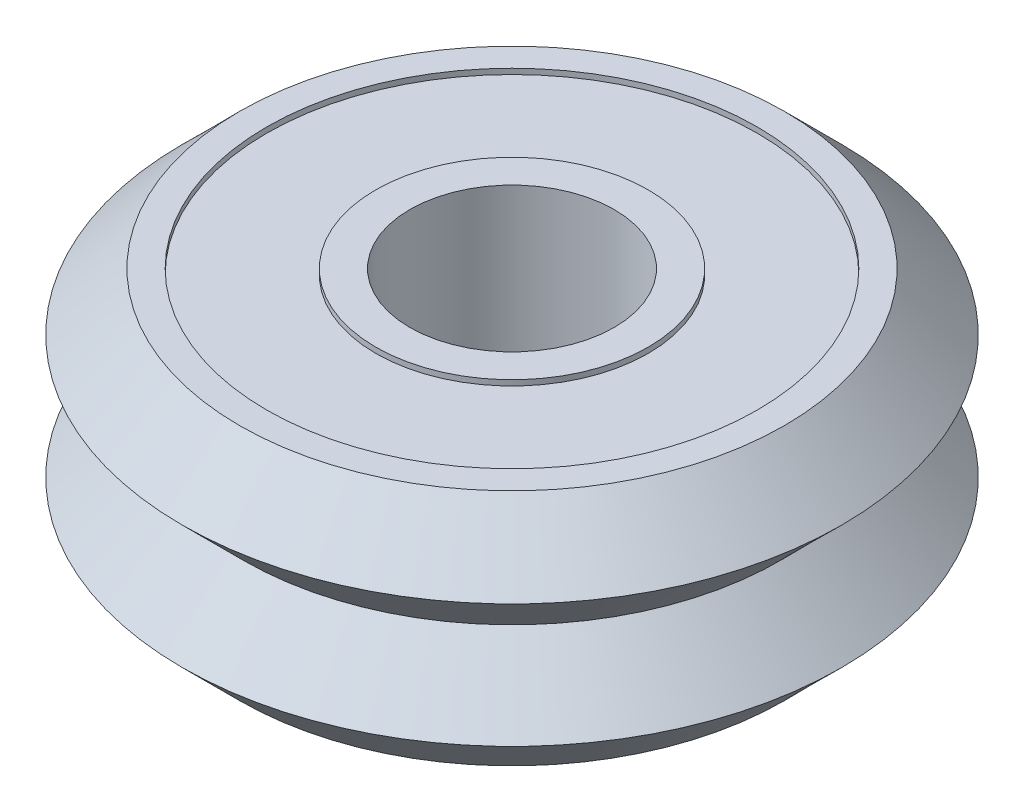
ISO-10303-21;
HEADER;
FILE_DESCRIPTION(('STEP AP214'),'2;1');
FILE_NAME('part.step','',(''),(''),'','','');
FILE_SCHEMA(('AUTOMOTIVE_DESIGN { 1 0 10303 214 1 1 1 1 }'));
ENDSEC;
DATA;
#1=APPLICATION_CONTEXT('core data for automotive mechanical design processes');
#2=APPLICATION_PROTOCOL_DEFINITION('international standard','automotive_design',2000,#1);
#3=PRODUCT_CONTEXT('',#1,'mechanical');
#4=PRODUCT('Part','Part','',(#3));
#5=PRODUCT_RELATED_PRODUCT_CATEGORY('part','',(#4));
#6=PRODUCT_DEFINITION_FORMATION('','',#4);
#7=PRODUCT_DEFINITION_CONTEXT('part definition',#1,'design');
#8=PRODUCT_DEFINITION('design','',#6,#7);
#9=PRODUCT_DEFINITION_SHAPE('','',#8);
#10=(LENGTH_UNIT() NAMED_UNIT(*) SI_UNIT(.MILLI.,.METRE.));
#11=(NAMED_UNIT(*) PLANE_ANGLE_UNIT() SI_UNIT($,.RADIAN.));
#12=(NAMED_UNIT(*) SI_UNIT($,.STERADIAN.) SOLID_ANGLE_UNIT());
#13=UNCERTAINTY_MEASURE_WITH_UNIT(LENGTH_MEASURE(1.E-05),#10,'distance_accuracy_value','');
#14=(GEOMETRIC_REPRESENTATION_CONTEXT(3) GLOBAL_UNCERTAINTY_ASSIGNED_CONTEXT((#13)) GLOBAL_UNIT_ASSIGNED_CONTEXT((#10,
#11,#12)) REPRESENTATION_CONTEXT('',''));
#15=CARTESIAN_POINT('',(0.,0.,0.));
#16=DIRECTION('',(0.,0.,1.));
#17=DIRECTION('',(1.,0.,0.));
#18=AXIS2_PLACEMENT_3D('',#15,#16,#17);
#19=CARTESIAN_POINT('',(6.35,5.296,0.));
#20=DIRECTION('',(0.,1.,0.));
#21=DIRECTION('',(0.,0.,1.));
#22=AXIS2_PLACEMENT_3D('',#19,#20,#21);
#23=PLANE('',#22);
#24=CARTESIAN_POINT('',(0.,5.296,0.));
#25=DIRECTION('',(0.,1.,0.));
#26=DIRECTION('',(0.,0.,1.));
#27=AXIS2_PLACEMENT_3D('',#24,#25,#26);
#28=CIRCLE('',#27,11.43);
#29=CARTESIAN_POINT('',(0.,5.296,11.43));
#30=VERTEX_POINT('',#29);
#31=EDGE_CURVE('E80',#30,#30,#28,.T.);
#32=ORIENTED_EDGE('',*,*,#31,.T.);
#33=EDGE_LOOP('',(#32));
#34=FACE_BOUND('',#33,.T.);
#35=CARTESIAN_POINT('',(0.,5.296,0.));
#36=DIRECTION('',(0.,1.,0.));
#37=DIRECTION('',(0.,0.,1.));
#38=AXIS2_PLACEMENT_3D('',#35,#36,#37);
#39=CIRCLE('',#38,6.35);
#40=CARTESIAN_POINT('',(0.,5.296,6.35));
#41=VERTEX_POINT('',#40);
#42=EDGE_CURVE('E10',#41,#41,#39,.T.);
#43=ORIENTED_EDGE('',*,*,#42,.F.);
#44=EDGE_LOOP('',(#43));
#45=FACE_BOUND('',#44,.T.);
#46=ADVANCED_FACE('F31',(#34,#45),#23,.T.);
#47=CARTESIAN_POINT('',(0.,-5.55,0.));
#48=DIRECTION('',(0.,1.,0.));
#49=DIRECTION('',(0.,0.,1.));
#50=AXIS2_PLACEMENT_3D('',#47,#48,#49);
#51=CYLINDRICAL_SURFACE('',#50,6.35);
#52=ORIENTED_EDGE('',*,*,#42,.T.);
#53=EDGE_LOOP('',(#52));
#54=FACE_BOUND('',#53,.T.);
#55=CARTESIAN_POINT('',(0.,5.55,0.));
#56=DIRECTION('',(0.,1.,0.));
#57=DIRECTION('',(0.,0.,1.));
#58=AXIS2_PLACEMENT_3D('',#55,#56,#57);
#59=CIRCLE('',#58,6.35);
#60=CARTESIAN_POINT('',(0.,5.55,6.35));
#61=VERTEX_POINT('',#60);
#62=EDGE_CURVE('E37',#61,#61,#59,.T.);
#63=ORIENTED_EDGE('',*,*,#62,.F.);
#64=EDGE_LOOP('',(#63));
#65=FACE_BOUND('',#64,.T.);
#66=ADVANCED_FACE('F98',(#54,#65),#51,.T.);
#67=CARTESIAN_POINT('',(4.7625,5.55,0.));
#68=DIRECTION('',(0.,1.,0.));
#69=DIRECTION('',(0.,0.,1.));
#70=AXIS2_PLACEMENT_3D('',#67,#68,#69);
#71=PLANE('',#70);
#72=ORIENTED_EDGE('',*,*,#62,.T.);
#73=EDGE_LOOP('',(#72));
#74=FACE_BOUND('',#73,.T.);
#75=CARTESIAN_POINT('',(0.,5.55,0.));
#76=DIRECTION('',(0.,1.,0.));
#77=DIRECTION('',(0.,0.,1.));
#78=AXIS2_PLACEMENT_3D('',#75,#76,#77);
#79=CIRCLE('',#78,4.7625);
#80=CARTESIAN_POINT('',(0.,5.55,4.7625));
#81=VERTEX_POINT('',#80);
#82=EDGE_CURVE('E41',#81,#81,#79,.T.);
#83=ORIENTED_EDGE('',*,*,#82,.F.);
#84=EDGE_LOOP('',(#83));
#85=FACE_BOUND('',#84,.T.);
#86=ADVANCED_FACE('F102',(#74,#85),#71,.T.);
#87=CARTESIAN_POINT('',(0.,-5.55,0.));
#88=DIRECTION('',(0.,1.,0.));
#89=DIRECTION('',(0.,0.,1.));
#90=AXIS2_PLACEMENT_3D('',#87,#88,#89);
#91=CYLINDRICAL_SURFACE('',#90,4.7625);
#92=ORIENTED_EDGE('',*,*,#82,.T.);
#93=EDGE_LOOP('',(#92));
#94=FACE_BOUND('',#93,.T.);
#95=CARTESIAN_POINT('',(0.,-5.55,0.));
#96=DIRECTION('',(0.,1.,0.));
#97=DIRECTION('',(0.,0.,1.));
#98=AXIS2_PLACEMENT_3D('',#95,#96,#97);
#99=CIRCLE('',#98,4.7625);
#100=CARTESIAN_POINT('',(0.,-5.55,4.7625));
#101=VERTEX_POINT('',#100);
#102=EDGE_CURVE('E45',#101,#101,#99,.T.);
#103=ORIENTED_EDGE('',*,*,#102,.F.);
#104=EDGE_LOOP('',(#103));
#105=FACE_BOUND('',#104,.T.);
#106=ADVANCED_FACE('F106',(#94,#105),#91,.F.);
#107=CARTESIAN_POINT('',(6.35,-5.55,0.));
#108=DIRECTION('',(0.,-1.,0.));
#109=DIRECTION('',(0.,0.,-1.));
#110=AXIS2_PLACEMENT_3D('',#107,#108,#109);
#111=PLANE('',#110);
#112=ORIENTED_EDGE('',*,*,#102,.T.);
#113=EDGE_LOOP('',(#112));
#114=FACE_BOUND('',#113,.T.);
#115=CARTESIAN_POINT('',(0.,-5.55,0.));
#116=DIRECTION('',(0.,1.,0.));
#117=DIRECTION('',(0.,0.,1.));
#118=AXIS2_PLACEMENT_3D('',#115,#116,#117);
#119=CIRCLE('',#118,6.35);
#120=CARTESIAN_POINT('',(0.,-5.55,6.35));
#121=VERTEX_POINT('',#120);
#122=EDGE_CURVE('E50',#121,#121,#119,.T.);
#123=ORIENTED_EDGE('',*,*,#122,.F.);
#124=EDGE_LOOP('',(#123));
#125=FACE_BOUND('',#124,.T.);
#126=ADVANCED_FACE('F112',(#114,#125),#111,.T.);
#127=CARTESIAN_POINT('',(0.,-5.55,0.));
#128=DIRECTION('',(0.,1.,0.));
#129=DIRECTION('',(0.,0.,1.));
#130=AXIS2_PLACEMENT_3D('',#127,#128,#129);
#131=CYLINDRICAL_SURFACE('',#130,6.35);
#132=ORIENTED_EDGE('',*,*,#122,.T.);
#133=EDGE_LOOP('',(#132));
#134=FACE_BOUND('',#133,.T.);
#135=CARTESIAN_POINT('',(0.,-5.296,0.));
#136=DIRECTION('',(0.,1.,0.));
#137=DIRECTION('',(0.,0.,1.));
#138=AXIS2_PLACEMENT_3D('',#135,#136,#137);
#139=CIRCLE('',#138,6.35);
#140=CARTESIAN_POINT('',(0.,-5.296,6.35));
#141=VERTEX_POINT('',#140);
#142=EDGE_CURVE('E53',#141,#141,#139,.T.);
#143=ORIENTED_EDGE('',*,*,#142,.F.);
#144=EDGE_LOOP('',(#143));
#145=FACE_BOUND('',#144,.T.);
#146=ADVANCED_FACE('F116',(#134,#145),#131,.T.);
#147=CARTESIAN_POINT('',(11.43,-5.296,0.));
#148=DIRECTION('',(0.,-1.,0.));
#149=DIRECTION('',(0.,0.,-1.));
#150=AXIS2_PLACEMENT_3D('',#147,#148,#149);
#151=PLANE('',#150);
#152=ORIENTED_EDGE('',*,*,#142,.T.);
#153=EDGE_LOOP('',(#152));
#154=FACE_BOUND('',#153,.T.);
#155=CARTESIAN_POINT('',(0.,-5.296,0.));
#156=DIRECTION('',(0.,1.,0.));
#157=DIRECTION('',(0.,0.,1.));
#158=AXIS2_PLACEMENT_3D('',#155,#156,#157);
#159=CIRCLE('',#158,11.43);
#160=CARTESIAN_POINT('',(0.,-5.296,11.43));
#161=VERTEX_POINT('',#160);
#162=EDGE_CURVE('E56',#161,#161,#159,.T.);
#163=ORIENTED_EDGE('',*,*,#162,.F.);
#164=EDGE_LOOP('',(#163));
#165=FACE_BOUND('',#164,.T.);
#166=ADVANCED_FACE('F120',(#154,#165),#151,.T.);
#167=CARTESIAN_POINT('',(0.,-5.55,0.));
#168=DIRECTION('',(0.,1.,0.));
#169=DIRECTION('',(0.,0.,1.));
#170=AXIS2_PLACEMENT_3D('',#167,#168,#169);
#171=CYLINDRICAL_SURFACE('',#170,11.43);
#172=ORIENTED_EDGE('',*,*,#162,.T.);
#173=EDGE_LOOP('',(#172));
#174=FACE_BOUND('',#173,.T.);
#175=CARTESIAN_POINT('',(0.,-5.55,0.));
#176=DIRECTION('',(0.,1.,0.));
#177=DIRECTION('',(0.,0.,1.));
#178=AXIS2_PLACEMENT_3D('',#175,#176,#177);
#179=CIRCLE('',#178,11.43);
#180=CARTESIAN_POINT('',(0.,-5.55,11.43));
#181=VERTEX_POINT('',#180);
#182=EDGE_CURVE('E59',#181,#181,#179,.T.);
#183=ORIENTED_EDGE('',*,*,#182,.F.);
#184=EDGE_LOOP('',(#183));
#185=FACE_BOUND('',#184,.T.);
#186=ADVANCED_FACE('F124',(#174,#185),#171,.F.);
#187=CARTESIAN_POINT('',(12.69,-5.55,0.));
#188=DIRECTION('',(0.,-1.,0.));
#189=DIRECTION('',(0.,0.,-1.));
#190=AXIS2_PLACEMENT_3D('',#187,#188,#189);
#191=PLANE('',#190);
#192=ORIENTED_EDGE('',*,*,#182,.T.);
#193=EDGE_LOOP('',(#192));
#194=FACE_BOUND('',#193,.T.);
#195=CARTESIAN_POINT('',(0.,-5.55,0.));
#196=DIRECTION('',(0.,1.,0.));
#197=DIRECTION('',(0.,0.,1.));
#198=AXIS2_PLACEMENT_3D('',#195,#196,#197);
#199=CIRCLE('',#198,12.69);
#200=CARTESIAN_POINT('',(0.,-5.55,12.69));
#201=VERTEX_POINT('',#200);
#202=EDGE_CURVE('E62',#201,#201,#199,.T.);
#203=ORIENTED_EDGE('',*,*,#202,.F.);
#204=EDGE_LOOP('',(#203));
#205=FACE_BOUND('',#204,.T.);
#206=ADVANCED_FACE('F128',(#194,#205),#191,.T.);
#207=CARTESIAN_POINT('',(0.,-2.87500000000001,0.));
#208=DIRECTION('',(0.,1.,0.));
#209=DIRECTION('',(0.,0.,1.));
#210=AXIS2_PLACEMENT_3D('',#207,#208,#209);
#211=CONICAL_SURFACE('',#210,15.365,0.78539816339745);
#212=ORIENTED_EDGE('',*,*,#202,.T.);
#213=EDGE_LOOP('',(#212));
#214=FACE_BOUND('',#213,.T.);
#215=CARTESIAN_POINT('',(0.,-2.87500000000001,0.));
#216=DIRECTION('',(0.,1.,0.));
#217=DIRECTION('',(0.,0.,1.));
#218=AXIS2_PLACEMENT_3D('',#215,#216,#217);
#219=CIRCLE('',#218,15.365);
#220=CARTESIAN_POINT('',(0.,-2.87500000000001,15.365));
#221=VERTEX_POINT('',#220);
#222=EDGE_CURVE('E65',#221,#221,#219,.T.);
#223=ORIENTED_EDGE('',*,*,#222,.F.);
#224=EDGE_LOOP('',(#223));
#225=FACE_BOUND('',#224,.T.);
#226=ADVANCED_FACE('F132',(#214,#225),#211,.T.);
#227=CARTESIAN_POINT('',(0.,0.,0.));
#228=DIRECTION('',(0.,-1.,0.));
#229=DIRECTION('',(0.,0.,-1.));
#230=AXIS2_PLACEMENT_3D('',#227,#228,#229);
#231=CONICAL_SURFACE('',#230,12.49,0.785398163397447);
#232=ORIENTED_EDGE('',*,*,#222,.T.);
#233=EDGE_LOOP('',(#232));
#234=FACE_BOUND('',#233,.T.);
#235=CARTESIAN_POINT('',(0.,0.,0.));
#236=DIRECTION('',(0.,1.,0.));
#237=DIRECTION('',(0.,0.,1.));
#238=AXIS2_PLACEMENT_3D('',#235,#236,#237);
#239=CIRCLE('',#238,12.49);
#240=CARTESIAN_POINT('',(0.,0.,12.49));
#241=VERTEX_POINT('',#240);
#242=EDGE_CURVE('E68',#241,#241,#239,.T.);
#243=ORIENTED_EDGE('',*,*,#242,.F.);
#244=EDGE_LOOP('',(#243));
#245=FACE_BOUND('',#244,.T.);
#246=ADVANCED_FACE('F136',(#234,#245),#231,.T.);
#247=CARTESIAN_POINT('',(0.,2.875,0.));
#248=DIRECTION('',(0.,1.,0.));
#249=DIRECTION('',(0.,0.,1.));
#250=AXIS2_PLACEMENT_3D('',#247,#248,#249);
#251=CONICAL_SURFACE('',#250,15.365,0.785398163397447);
#252=ORIENTED_EDGE('',*,*,#242,.T.);
#253=EDGE_LOOP('',(#252));
#254=FACE_BOUND('',#253,.T.);
#255=CARTESIAN_POINT('',(0.,2.875,0.));
#256=DIRECTION('',(0.,1.,0.));
#257=DIRECTION('',(0.,0.,1.));
#258=AXIS2_PLACEMENT_3D('',#255,#256,#257);
#259=CIRCLE('',#258,15.365);
#260=CARTESIAN_POINT('',(0.,2.875,15.365));
#261=VERTEX_POINT('',#260);
#262=EDGE_CURVE('E71',#261,#261,#259,.T.);
#263=ORIENTED_EDGE('',*,*,#262,.F.);
#264=EDGE_LOOP('',(#263));
#265=FACE_BOUND('',#264,.T.);
#266=ADVANCED_FACE('F140',(#254,#265),#251,.T.);
#267=CARTESIAN_POINT('',(0.,5.55,0.));
#268=DIRECTION('',(0.,-1.,0.));
#269=DIRECTION('',(0.,0.,-1.));
#270=AXIS2_PLACEMENT_3D('',#267,#268,#269);
#271=CONICAL_SURFACE('',#270,12.69,0.785398163397448);
#272=ORIENTED_EDGE('',*,*,#262,.T.);
#273=EDGE_LOOP('',(#272));
#274=FACE_BOUND('',#273,.T.);
#275=CARTESIAN_POINT('',(0.,5.55,0.));
#276=DIRECTION('',(0.,1.,0.));
#277=DIRECTION('',(0.,0.,1.));
#278=AXIS2_PLACEMENT_3D('',#275,#276,#277);
#279=CIRCLE('',#278,12.69);
#280=CARTESIAN_POINT('',(0.,5.55,12.69));
#281=VERTEX_POINT('',#280);
#282=EDGE_CURVE('E74',#281,#281,#279,.T.);
#283=ORIENTED_EDGE('',*,*,#282,.F.);
#284=EDGE_LOOP('',(#283));
#285=FACE_BOUND('',#284,.T.);
#286=ADVANCED_FACE('F94',(#274,#285),#271,.T.);
#287=CARTESIAN_POINT('',(11.43,5.55,0.));
#288=DIRECTION('',(0.,1.,0.));
#289=DIRECTION('',(0.,0.,1.));
#290=AXIS2_PLACEMENT_3D('',#287,#288,#289);
#291=PLANE('',#290);
#292=ORIENTED_EDGE('',*,*,#282,.T.);
#293=EDGE_LOOP('',(#292));
#294=FACE_BOUND('',#293,.T.);
#295=CARTESIAN_POINT('',(0.,5.55,0.));
#296=DIRECTION('',(0.,1.,0.));
#297=DIRECTION('',(0.,0.,1.));
#298=AXIS2_PLACEMENT_3D('',#295,#296,#297);
#299=CIRCLE('',#298,11.43);
#300=CARTESIAN_POINT('',(0.,5.55,11.43));
#301=VERTEX_POINT('',#300);
#302=EDGE_CURVE('E77',#301,#301,#299,.T.);
#303=ORIENTED_EDGE('',*,*,#302,.F.);
#304=EDGE_LOOP('',(#303));
#305=FACE_BOUND('',#304,.T.);
#306=ADVANCED_FACE('F88',(#294,#305),#291,.T.);
#307=CARTESIAN_POINT('',(0.,-5.55,0.));
#308=DIRECTION('',(0.,1.,0.));
#309=DIRECTION('',(0.,0.,1.));
#310=AXIS2_PLACEMENT_3D('',#307,#308,#309);
#311=CYLINDRICAL_SURFACE('',#310,11.43);
#312=ORIENTED_EDGE('',*,*,#302,.T.);
#313=EDGE_LOOP('',(#312));
#314=FACE_BOUND('',#313,.T.);
#315=ORIENTED_EDGE('',*,*,#31,.F.);
#316=EDGE_LOOP('',(#315));
#317=FACE_BOUND('',#316,.T.);
#318=ADVANCED_FACE('F86',(#314,#317),#311,.F.);
#319=CLOSED_SHELL('',(#46,#66,#86,#106,#126,#146,#166,#186,#206,#226,#246,#266,#286,#306,#318));
#320=MANIFOLD_SOLID_BREP('B2',#319);
#321=ADVANCED_BREP_SHAPE_REPRESENTATION('',(#18,#320),#14);
#322=SHAPE_DEFINITION_REPRESENTATION(#9,#321);
ENDSEC;
END-ISO-10303-21;
